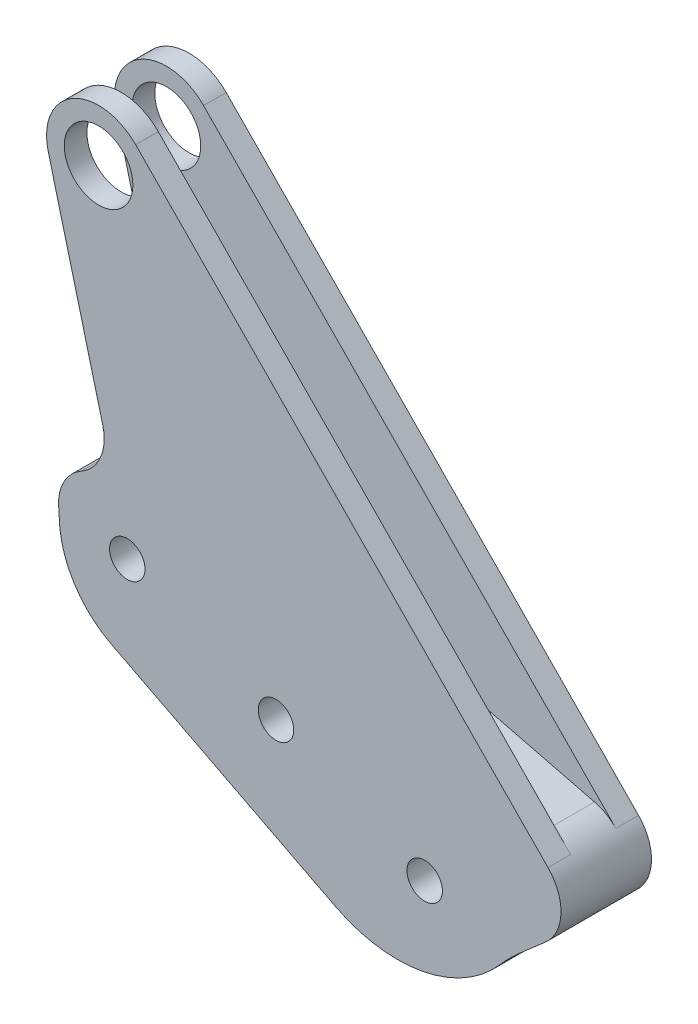
ISO-10303-21;
HEADER;
FILE_DESCRIPTION(('STEP AP214'),'2;1');
FILE_NAME('part.step','',(''),(''),'','','');
FILE_SCHEMA(('AUTOMOTIVE_DESIGN { 1 0 10303 214 1 1 1 1 }'));
ENDSEC;
DATA;
#1=APPLICATION_CONTEXT('core data for automotive mechanical design processes');
#2=APPLICATION_PROTOCOL_DEFINITION('international standard','automotive_design',2000,#1);
#3=PRODUCT_CONTEXT('',#1,'mechanical');
#4=PRODUCT('Part','Part','',(#3));
#5=PRODUCT_RELATED_PRODUCT_CATEGORY('part','',(#4));
#6=PRODUCT_DEFINITION_FORMATION('','',#4);
#7=PRODUCT_DEFINITION_CONTEXT('part definition',#1,'design');
#8=PRODUCT_DEFINITION('design','',#6,#7);
#9=PRODUCT_DEFINITION_SHAPE('','',#8);
#10=(LENGTH_UNIT() NAMED_UNIT(*) SI_UNIT(.MILLI.,.METRE.));
#11=(NAMED_UNIT(*) PLANE_ANGLE_UNIT() SI_UNIT($,.RADIAN.));
#12=(NAMED_UNIT(*) SI_UNIT($,.STERADIAN.) SOLID_ANGLE_UNIT());
#13=UNCERTAINTY_MEASURE_WITH_UNIT(LENGTH_MEASURE(1.E-05),#10,'distance_accuracy_value','');
#14=(GEOMETRIC_REPRESENTATION_CONTEXT(3) GLOBAL_UNCERTAINTY_ASSIGNED_CONTEXT((#13)) GLOBAL_UNIT_ASSIGNED_CONTEXT((#10,
#11,#12)) REPRESENTATION_CONTEXT('',''));
#15=CARTESIAN_POINT('',(0.,0.,0.));
#16=DIRECTION('',(0.,0.,1.));
#17=DIRECTION('',(1.,0.,0.));
#18=AXIS2_PLACEMENT_3D('',#15,#16,#17);
#19=CARTESIAN_POINT('',(88.7215933381022,356.844491165413,3.175));
#20=DIRECTION('',(-0.241282436614149,-0.97045493753267,0.));
#21=DIRECTION('',(0.970454937532671,-0.241282436614149,0.));
#22=AXIS2_PLACEMENT_3D('',#19,#20,#21);
#23=PLANE('',#22);
#24=DIRECTION('',(-0.970454937532671,0.241282436614149,0.));
#25=VECTOR('',#24,1.);
#26=CARTESIAN_POINT('',(88.7215933381022,356.844491165413,0.));
#27=LINE('',#26,#25);
#28=CARTESIAN_POINT('',(409.152663011232,277.176300229955,0.));
#29=VERTEX_POINT('',#28);
#30=CARTESIAN_POINT('',(351.340613212572,291.55000446041,0.));
#31=VERTEX_POINT('',#30);
#32=EDGE_CURVE('E267',#29,#31,#27,.T.);
#33=ORIENTED_EDGE('',*,*,#32,.T.);
#34=DIRECTION('',(0.,0.,-1.));
#35=VECTOR('',#34,1.);
#36=CARTESIAN_POINT('',(351.340613212572,291.55000446041,3.175));
#37=LINE('',#36,#35);
#38=CARTESIAN_POINT('',(351.340613212572,291.55000446041,6.35));
#39=VERTEX_POINT('',#38);
#40=EDGE_CURVE('E290',#39,#31,#37,.T.);
#41=ORIENTED_EDGE('',*,*,#40,.F.);
#42=DIRECTION('',(-0.970454937532671,0.241282436614149,0.));
#43=VECTOR('',#42,1.);
#44=CARTESIAN_POINT('',(409.152663011232,277.176300229955,6.35));
#45=LINE('',#44,#43);
#46=CARTESIAN_POINT('',(409.152663011232,277.176300229955,6.35));
#47=VERTEX_POINT('',#46);
#48=EDGE_CURVE('E196',#47,#39,#45,.T.);
#49=ORIENTED_EDGE('',*,*,#48,.F.);
#50=DIRECTION('',(0.,0.,-1.));
#51=VECTOR('',#50,1.);
#52=CARTESIAN_POINT('',(409.152663011232,277.176300229955,3.175));
#53=LINE('',#52,#51);
#54=EDGE_CURVE('E273',#47,#29,#53,.T.);
#55=ORIENTED_EDGE('',*,*,#54,.T.);
#56=EDGE_LOOP('',(#33,#41,#49,#55));
#57=FACE_BOUND('',#56,.T.);
#58=ADVANCED_FACE('F39',(#57),#23,.F.);
#59=CARTESIAN_POINT('',(349.808469740072,285.387615607076,3.175));
#60=DIRECTION('',(0.,0.,-1.));
#61=DIRECTION('',(-1.,0.,0.));
#62=AXIS2_PLACEMENT_3D('',#59,#60,#61);
#63=CYLINDRICAL_SURFACE('',#62,6.3500000000013);
#64=ORIENTED_EDGE('',*,*,#40,.T.);
#65=CARTESIAN_POINT('',(349.808469740072,285.387615607076,0.));
#66=DIRECTION('',(0.,0.,-1.));
#67=DIRECTION('',(-1.,0.,0.));
#68=AXIS2_PLACEMENT_3D('',#65,#66,#67);
#69=CIRCLE('',#68,6.3500000000013);
#70=CARTESIAN_POINT('',(346.660858499437,290.902599149921,0.));
#71=VERTEX_POINT('',#70);
#72=EDGE_CURVE('E54',#31,#71,#69,.F.);
#73=ORIENTED_EDGE('',*,*,#72,.T.);
#74=DIRECTION('',(0.,0.,-1.));
#75=VECTOR('',#74,1.);
#76=CARTESIAN_POINT('',(346.660858499437,290.902599149921,3.175));
#77=LINE('',#76,#75);
#78=CARTESIAN_POINT('',(346.660858499437,290.902599149921,-3.175));
#79=VERTEX_POINT('',#78);
#80=EDGE_CURVE('E305',#71,#79,#77,.T.);
#81=ORIENTED_EDGE('',*,*,#80,.T.);
#82=CARTESIAN_POINT('',(349.808469740072,285.387615607076,-3.175));
#83=DIRECTION('',(0.,0.,-1.));
#84=DIRECTION('',(-1.,0.,0.));
#85=AXIS2_PLACEMENT_3D('',#82,#83,#84);
#86=CIRCLE('',#85,6.3500000000013);
#87=CARTESIAN_POINT('',(343.504200024932,284.626903204923,-3.175));
#88=VERTEX_POINT('',#87);
#89=EDGE_CURVE('E240',#88,#79,#86,.T.);
#90=ORIENTED_EDGE('',*,*,#89,.F.);
#91=DIRECTION('',(0.,0.,-1.));
#92=VECTOR('',#91,1.);
#93=CARTESIAN_POINT('',(343.504200024932,284.626903204923,3.175));
#94=LINE('',#93,#92);
#95=CARTESIAN_POINT('',(343.504200024932,284.626903204923,9.525));
#96=VERTEX_POINT('',#95);
#97=EDGE_CURVE('E288',#96,#88,#94,.T.);
#98=ORIENTED_EDGE('',*,*,#97,.F.);
#99=CARTESIAN_POINT('',(349.808469740072,285.387615607076,9.525));
#100=DIRECTION('',(0.,0.,1.));
#101=DIRECTION('',(1.,0.,0.));
#102=AXIS2_PLACEMENT_3D('',#99,#100,#101);
#103=CIRCLE('',#102,6.35000000000136);
#104=CARTESIAN_POINT('',(346.660858499437,290.902599149921,9.525));
#105=VERTEX_POINT('',#104);
#106=EDGE_CURVE('E177',#105,#96,#103,.T.);
#107=ORIENTED_EDGE('',*,*,#106,.F.);
#108=DIRECTION('',(0.,0.,-1.));
#109=VECTOR('',#108,1.);
#110=CARTESIAN_POINT('',(346.660858499437,290.902599149921,3.175));
#111=LINE('',#110,#109);
#112=CARTESIAN_POINT('',(346.660858499437,290.902599149921,6.35));
#113=VERTEX_POINT('',#112);
#114=EDGE_CURVE('E294',#105,#113,#111,.T.);
#115=ORIENTED_EDGE('',*,*,#114,.T.);
#116=CARTESIAN_POINT('',(349.808469740072,285.387615607076,6.35));
#117=DIRECTION('',(0.,0.,1.));
#118=DIRECTION('',(1.,0.,0.));
#119=AXIS2_PLACEMENT_3D('',#116,#117,#118);
#120=CIRCLE('',#119,6.3500000000013);
#121=EDGE_CURVE('E292',#113,#39,#120,.F.);
#122=ORIENTED_EDGE('',*,*,#121,.T.);
#123=EDGE_LOOP('',(#64,#73,#81,#90,#98,#107,#115,#122));
#124=FACE_BOUND('',#123,.T.);
#125=ADVANCED_FACE('F309',(#124),#63,.T.);
#126=CARTESIAN_POINT('',(336.241681313093,283.750562517643,3.175));
#127=DIRECTION('',(0.,0.,-1.));
#128=DIRECTION('',(-1.,0.,0.));
#129=AXIS2_PLACEMENT_3D('',#126,#127,#128);
#130=CYLINDRICAL_SURFACE('',#129,7.31519999999985);
#131=ORIENTED_EDGE('',*,*,#97,.T.);
#132=CARTESIAN_POINT('',(336.241681313093,283.750562517643,-3.175));
#133=DIRECTION('',(0.,0.,-1.));
#134=DIRECTION('',(-1.,0.,0.));
#135=AXIS2_PLACEMENT_3D('',#132,#133,#134);
#136=CIRCLE('',#135,7.31519999999985);
#137=CARTESIAN_POINT('',(343.556433482051,283.831505378497,-3.175));
#138=VERTEX_POINT('',#137);
#139=EDGE_CURVE('E237',#138,#88,#136,.F.);
#140=ORIENTED_EDGE('',*,*,#139,.F.);
#141=DIRECTION('',(0.,0.,-1.));
#142=VECTOR('',#141,1.);
#143=CARTESIAN_POINT('',(343.556433482051,283.831505378497,3.175));
#144=LINE('',#143,#142);
#145=CARTESIAN_POINT('',(343.556433482051,283.831505378497,9.525));
#146=VERTEX_POINT('',#145);
#147=EDGE_CURVE('E286',#146,#138,#144,.T.);
#148=ORIENTED_EDGE('',*,*,#147,.F.);
#149=CARTESIAN_POINT('',(336.241681313093,283.750562517643,9.525));
#150=DIRECTION('',(0.,0.,-1.));
#151=DIRECTION('',(1.,0.,0.));
#152=AXIS2_PLACEMENT_3D('',#149,#150,#151);
#153=CIRCLE('',#152,7.31519999999985);
#154=EDGE_CURVE('E370',#96,#146,#153,.T.);
#155=ORIENTED_EDGE('',*,*,#154,.F.);
#156=EDGE_LOOP('',(#131,#140,#148,#155));
#157=FACE_BOUND('',#156,.T.);
#158=ADVANCED_FACE('F396',(#157),#130,.F.);
#159=CARTESIAN_POINT('',(357.075851611338,283.981107218067,3.175));
#160=DIRECTION('',(0.,0.,-1.));
#161=DIRECTION('',(-1.,0.,0.));
#162=AXIS2_PLACEMENT_3D('',#159,#160,#161);
#163=CYLINDRICAL_SURFACE('',#162,13.520245828568);
#164=ORIENTED_EDGE('',*,*,#147,.T.);
#165=CARTESIAN_POINT('',(357.075851611338,283.981107218067,-3.175));
#166=DIRECTION('',(0.,0.,-1.));
#167=DIRECTION('',(-1.,0.,0.));
#168=AXIS2_PLACEMENT_3D('',#165,#166,#167);
#169=CIRCLE('',#168,13.520245828568);
#170=CARTESIAN_POINT('',(350.899273805199,271.954181847483,-3.175));
#171=VERTEX_POINT('',#170);
#172=EDGE_CURVE('E234',#171,#138,#169,.T.);
#173=ORIENTED_EDGE('',*,*,#172,.F.);
#174=DIRECTION('',(0.,0.,-1.));
#175=VECTOR('',#174,1.);
#176=CARTESIAN_POINT('',(350.899273805198,271.954181847483,3.175));
#177=LINE('',#176,#175);
#178=CARTESIAN_POINT('',(350.899273805199,271.954181847483,9.525));
#179=VERTEX_POINT('',#178);
#180=EDGE_CURVE('E284',#179,#171,#177,.T.);
#181=ORIENTED_EDGE('',*,*,#180,.F.);
#182=CARTESIAN_POINT('',(357.075851611338,283.981107218067,9.525));
#183=DIRECTION('',(0.,0.,1.));
#184=DIRECTION('',(1.,0.,0.));
#185=AXIS2_PLACEMENT_3D('',#182,#183,#184);
#186=CIRCLE('',#185,13.520245828568);
#187=EDGE_CURVE('E372',#146,#179,#186,.T.);
#188=ORIENTED_EDGE('',*,*,#187,.F.);
#189=EDGE_LOOP('',(#164,#173,#181,#188));
#190=FACE_BOUND('',#189,.T.);
#191=ADVANCED_FACE('F393',(#190),#163,.T.);
#192=CARTESIAN_POINT('',(183.750390628046,357.795579406841,3.175));
#193=DIRECTION('',(0.456839164350765,0.889549311682773,0.));
#194=DIRECTION('',(-0.889549311682773,0.456839164350765,0.));
#195=AXIS2_PLACEMENT_3D('',#192,#193,#194);
#196=PLANE('',#195);
#197=ORIENTED_EDGE('',*,*,#180,.T.);
#198=DIRECTION('',(-0.889549311682773,0.456839164350765,0.));
#199=VECTOR('',#198,1.);
#200=CARTESIAN_POINT('',(183.750390628046,357.79557940684,-3.175));
#201=LINE('',#200,#199);
#202=CARTESIAN_POINT('',(382.305231818593,255.825259677521,-3.175));
#203=VERTEX_POINT('',#202);
#204=EDGE_CURVE('E231',#203,#171,#201,.T.);
#205=ORIENTED_EDGE('',*,*,#204,.F.);
#206=DIRECTION('',(0.,0.,-1.));
#207=VECTOR('',#206,1.);
#208=CARTESIAN_POINT('',(382.305231818593,255.825259677521,3.175));
#209=LINE('',#208,#207);
#210=CARTESIAN_POINT('',(382.305231818593,255.82525967752,9.525));
#211=VERTEX_POINT('',#210);
#212=EDGE_CURVE('E282',#211,#203,#209,.T.);
#213=ORIENTED_EDGE('',*,*,#212,.F.);
#214=DIRECTION('',(0.889549311682772,-0.456839164350767,0.));
#215=VECTOR('',#214,1.);
#216=CARTESIAN_POINT('',(350.899273805199,271.954181847483,9.525));
#217=LINE('',#216,#215);
#218=EDGE_CURVE('E377',#179,#211,#217,.T.);
#219=ORIENTED_EDGE('',*,*,#218,.F.);
#220=EDGE_LOOP('',(#197,#205,#213,#219));
#221=FACE_BOUND('',#220,.T.);
#222=ADVANCED_FACE('F389',(#221),#196,.F.);
#223=CARTESIAN_POINT('',(391.008017899474,272.771174065075,3.175));
#224=DIRECTION('',(0.,0.,-1.));
#225=DIRECTION('',(-1.,0.,0.));
#226=AXIS2_PLACEMENT_3D('',#223,#224,#225);
#227=CYLINDRICAL_SURFACE('',#226,19.0499999999964);
#228=ORIENTED_EDGE('',*,*,#212,.T.);
#229=CARTESIAN_POINT('',(391.008017899474,272.771174065075,-3.175));
#230=DIRECTION('',(0.,0.,-1.));
#231=DIRECTION('',(-1.,0.,0.));
#232=AXIS2_PLACEMENT_3D('',#229,#230,#231);
#233=CIRCLE('',#232,19.0499999999964);
#234=CARTESIAN_POINT('',(405.371050703044,260.256950610005,-3.175));
#235=VERTEX_POINT('',#234);
#236=EDGE_CURVE('E228',#235,#203,#233,.T.);
#237=ORIENTED_EDGE('',*,*,#236,.F.);
#238=DIRECTION('',(0.,0.,-1.));
#239=VECTOR('',#238,1.);
#240=CARTESIAN_POINT('',(405.371050703044,260.256950610005,3.175));
#241=LINE('',#240,#239);
#242=CARTESIAN_POINT('',(405.371050703046,260.256950610003,9.525));
#243=VERTEX_POINT('',#242);
#244=EDGE_CURVE('E280',#243,#235,#241,.T.);
#245=ORIENTED_EDGE('',*,*,#244,.F.);
#246=CARTESIAN_POINT('',(391.008017899474,272.771174065075,9.525));
#247=DIRECTION('',(0.,0.,1.));
#248=DIRECTION('',(1.,0.,0.));
#249=AXIS2_PLACEMENT_3D('',#246,#247,#248);
#250=CIRCLE('',#249,19.0499999999973);
#251=EDGE_CURVE('E349',#211,#243,#250,.T.);
#252=ORIENTED_EDGE('',*,*,#251,.F.);
#253=EDGE_LOOP('',(#228,#237,#245,#252));
#254=FACE_BOUND('',#253,.T.);
#255=ADVANCED_FACE('F387',(#254),#227,.T.);
#256=CARTESIAN_POINT('',(427.990000000004,240.549512098068,3.175));
#257=DIRECTION('',(0.,0.,-1.));
#258=DIRECTION('',(-1.,0.,0.));
#259=AXIS2_PLACEMENT_3D('',#256,#257,#258);
#260=CYLINDRICAL_SURFACE('',#259,30.);
#261=ORIENTED_EDGE('',*,*,#244,.T.);
#262=CARTESIAN_POINT('',(427.990000000004,240.549512098068,-3.175));
#263=DIRECTION('',(0.,0.,-1.));
#264=DIRECTION('',(-1.,0.,0.));
#265=AXIS2_PLACEMENT_3D('',#262,#263,#264);
#266=CIRCLE('',#265,30.);
#267=CARTESIAN_POINT('',(408.282077798581,263.168039956942,-3.175));
#268=VERTEX_POINT('',#267);
#269=EDGE_CURVE('E225',#268,#235,#266,.F.);
#270=ORIENTED_EDGE('',*,*,#269,.F.);
#271=DIRECTION('',(0.,0.,-1.));
#272=VECTOR('',#271,1.);
#273=CARTESIAN_POINT('',(408.282077798581,263.168039956942,3.175));
#274=LINE('',#273,#272);
#275=CARTESIAN_POINT('',(408.282077798581,263.168039956942,9.525));
#276=VERTEX_POINT('',#275);
#277=EDGE_CURVE('E278',#276,#268,#274,.T.);
#278=ORIENTED_EDGE('',*,*,#277,.F.);
#279=CARTESIAN_POINT('',(427.990000000004,240.549512098068,9.525));
#280=DIRECTION('',(0.,0.,-1.));
#281=DIRECTION('',(1.,0.,0.));
#282=AXIS2_PLACEMENT_3D('',#279,#280,#281);
#283=CIRCLE('',#282,30.0000000000009);
#284=EDGE_CURVE('E346',#243,#276,#283,.T.);
#285=ORIENTED_EDGE('',*,*,#284,.F.);
#286=EDGE_LOOP('',(#261,#270,#278,#285));
#287=FACE_BOUND('',#286,.T.);
#288=ADVANCED_FACE('F383',(#287),#260,.F.);
#289=CARTESIAN_POINT('',(45.8519652743914,-52.6237085443779,3.175));
#290=DIRECTION('',(-0.656930740047429,0.753950928629137,0.));
#291=DIRECTION('',(-0.753950928629137,-0.656930740047429,0.));
#292=AXIS2_PLACEMENT_3D('',#289,#290,#291);
#293=PLANE('',#292);
#294=ORIENTED_EDGE('',*,*,#277,.T.);
#295=DIRECTION('',(-0.753950928629137,-0.656930740047429,0.));
#296=VECTOR('',#295,1.);
#297=CARTESIAN_POINT('',(45.8519652743914,-52.6237085443779,-3.175));
#298=LINE('',#297,#296);
#299=CARTESIAN_POINT('',(411.792029738034,266.226322979828,-3.175));
#300=VERTEX_POINT('',#299);
#301=EDGE_CURVE('E222',#300,#268,#298,.T.);
#302=ORIENTED_EDGE('',*,*,#301,.F.);
#303=DIRECTION('',(0.,0.,-1.));
#304=VECTOR('',#303,1.);
#305=CARTESIAN_POINT('',(411.792029738034,266.226322979828,3.175));
#306=LINE('',#305,#304);
#307=CARTESIAN_POINT('',(411.792029738034,266.226322979828,9.525));
#308=VERTEX_POINT('',#307);
#309=EDGE_CURVE('E276',#308,#300,#306,.T.);
#310=ORIENTED_EDGE('',*,*,#309,.F.);
#311=DIRECTION('',(0.753950928629145,0.656930740047419,0.));
#312=VECTOR('',#311,1.);
#313=CARTESIAN_POINT('',(408.282077798581,263.168039956942,9.525));
#314=LINE('',#313,#312);
#315=EDGE_CURVE('E342',#276,#308,#314,.T.);
#316=ORIENTED_EDGE('',*,*,#315,.F.);
#317=EDGE_LOOP('',(#294,#302,#310,#316));
#318=FACE_BOUND('',#317,.T.);
#319=ADVANCED_FACE('F341',(#318),#293,.F.);
#320=CARTESIAN_POINT('',(407.620519538733,271.013911376623,3.175));
#321=DIRECTION('',(0.,0.,-1.));
#322=DIRECTION('',(-1.,0.,0.));
#323=AXIS2_PLACEMENT_3D('',#320,#321,#322);
#324=CYLINDRICAL_SURFACE('',#323,6.34999999999994);
#325=ORIENTED_EDGE('',*,*,#309,.T.);
#326=CARTESIAN_POINT('',(407.620519538733,271.013911376623,-3.175));
#327=DIRECTION('',(0.,0.,-1.));
#328=DIRECTION('',(-1.,0.,0.));
#329=AXIS2_PLACEMENT_3D('',#326,#327,#328);
#330=CIRCLE('',#329,6.34999999999994);
#331=CARTESIAN_POINT('',(412.150918526643,275.463404045495,-3.175));
#332=VERTEX_POINT('',#331);
#333=EDGE_CURVE('E218',#332,#300,#330,.T.);
#334=ORIENTED_EDGE('',*,*,#333,.F.);
#335=DIRECTION('',(0.,0.,1.));
#336=VECTOR('',#335,1.);
#337=CARTESIAN_POINT('',(412.150918526643,275.463404045495,-3.175));
#338=LINE('',#337,#336);
#339=CARTESIAN_POINT('',(412.150918526643,275.463404045495,0.));
#340=VERTEX_POINT('',#339);
#341=EDGE_CURVE('E264',#332,#340,#338,.T.);
#342=ORIENTED_EDGE('',*,*,#341,.T.);
#343=CARTESIAN_POINT('',(407.620519538733,271.013911376623,0.));
#344=DIRECTION('',(0.,0.,1.));
#345=DIRECTION('',(1.,0.,0.));
#346=AXIS2_PLACEMENT_3D('',#343,#344,#345);
#347=CIRCLE('',#346,6.34999999999994);
#348=EDGE_CURVE('E270',#340,#29,#347,.T.);
#349=ORIENTED_EDGE('',*,*,#348,.T.);
#350=ORIENTED_EDGE('',*,*,#54,.F.);
#351=CARTESIAN_POINT('',(407.620519538733,271.013911376623,6.35));
#352=DIRECTION('',(0.,0.,1.));
#353=DIRECTION('',(1.,0.,0.));
#354=AXIS2_PLACEMENT_3D('',#351,#352,#353);
#355=CIRCLE('',#354,6.34999999999997);
#356=CARTESIAN_POINT('',(412.150918526643,275.463404045495,6.35));
#357=VERTEX_POINT('',#356);
#358=EDGE_CURVE('E192',#357,#47,#355,.T.);
#359=ORIENTED_EDGE('',*,*,#358,.F.);
#360=DIRECTION('',(0.,0.,-1.));
#361=VECTOR('',#360,1.);
#362=CARTESIAN_POINT('',(412.150918526643,275.463404045495,9.525));
#363=LINE('',#362,#361);
#364=CARTESIAN_POINT('',(412.150918526643,275.463404045495,9.525));
#365=VERTEX_POINT('',#364);
#366=EDGE_CURVE('E193',#365,#357,#363,.T.);
#367=ORIENTED_EDGE('',*,*,#366,.F.);
#368=CARTESIAN_POINT('',(407.620519538733,271.013911376623,9.525));
#369=DIRECTION('',(0.,0.,1.));
#370=DIRECTION('',(1.,0.,0.));
#371=AXIS2_PLACEMENT_3D('',#368,#369,#370);
#372=CIRCLE('',#371,6.34999999999996);
#373=EDGE_CURVE('E337',#308,#365,#372,.T.);
#374=ORIENTED_EDGE('',*,*,#373,.F.);
#375=EDGE_LOOP('',(#325,#334,#342,#349,#350,#359,#367,#374));
#376=FACE_BOUND('',#375,.T.);
#377=ADVANCED_FACE('F334',(#376),#324,.T.);
#378=CARTESIAN_POINT('',(347.497865744113,341.292060633783,-3.175));
#379=DIRECTION('',(0.713448659513392,0.700707506908941,0.));
#380=DIRECTION('',(-0.700707506908941,0.713448659513393,0.));
#381=AXIS2_PLACEMENT_3D('',#378,#379,#380);
#382=PLANE('',#381);
#383=DIRECTION('',(-0.700707506908941,0.713448659513393,0.));
#384=VECTOR('',#383,1.);
#385=CARTESIAN_POINT('',(347.497865744113,341.292060633783,0.));
#386=LINE('',#385,#384);
#387=CARTESIAN_POINT('',(354.286795224026,334.379686227604,0.));
#388=VERTEX_POINT('',#387);
#389=EDGE_CURVE('E209',#340,#388,#386,.T.);
#390=ORIENTED_EDGE('',*,*,#389,.F.);
#391=ORIENTED_EDGE('',*,*,#341,.F.);
#392=DIRECTION('',(-0.700707506908941,0.713448659513393,0.));
#393=VECTOR('',#392,1.);
#394=CARTESIAN_POINT('',(347.497865744113,341.292060633783,-3.175));
#395=LINE('',#394,#393);
#396=CARTESIAN_POINT('',(354.286795224026,334.379686227604,-3.175));
#397=VERTEX_POINT('',#396);
#398=EDGE_CURVE('E215',#332,#397,#395,.T.);
#399=ORIENTED_EDGE('',*,*,#398,.T.);
#400=DIRECTION('',(0.,0.,1.));
#401=VECTOR('',#400,1.);
#402=CARTESIAN_POINT('',(354.286795224026,334.379686227604,-3.175));
#403=LINE('',#402,#401);
#404=EDGE_CURVE('E251',#397,#388,#403,.T.);
#405=ORIENTED_EDGE('',*,*,#404,.T.);
#406=EDGE_LOOP('',(#390,#391,#399,#405));
#407=FACE_BOUND('',#406,.T.);
#408=ADVANCED_FACE('F332',(#407),#382,.T.);
#409=CARTESIAN_POINT('',(400.105216615457,104.069138523309,-3.175));
#410=DIRECTION('',(-0.967797889043687,-0.251728516387364,0.));
#411=DIRECTION('',(0.251728516387364,-0.967797889043687,0.));
#412=AXIS2_PLACEMENT_3D('',#409,#410,#411);
#413=PLANE('',#412);
#414=DIRECTION('',(0.251728516387364,-0.967797889043687,0.));
#415=VECTOR('',#414,1.);
#416=CARTESIAN_POINT('',(400.105216615457,104.069138523309,-3.175));
#417=LINE('',#416,#415);
#418=CARTESIAN_POINT('',(342.009492303188,327.424522167483,-3.175));
#419=VERTEX_POINT('',#418);
#420=CARTESIAN_POINT('',(349.658763854231,298.016058771824,-3.175));
#421=VERTEX_POINT('',#420);
#422=EDGE_CURVE('E243',#419,#421,#417,.T.);
#423=ORIENTED_EDGE('',*,*,#422,.T.);
#424=DIRECTION('',(0.,0.,-1.));
#425=VECTOR('',#424,1.);
#426=CARTESIAN_POINT('',(349.658763854231,298.016058771824,-3.175));
#427=LINE('',#426,#425);
#428=CARTESIAN_POINT('',(349.658763854231,298.016058771824,0.));
#429=VERTEX_POINT('',#428);
#430=EDGE_CURVE('E302',#421,#429,#427,.F.);
#431=ORIENTED_EDGE('',*,*,#430,.T.);
#432=DIRECTION('',(0.251728516387364,-0.967797889043687,0.));
#433=VECTOR('',#432,1.);
#434=CARTESIAN_POINT('',(400.105216615457,104.069138523309,0.));
#435=LINE('',#434,#433);
#436=CARTESIAN_POINT('',(342.009492303188,327.424522167483,0.));
#437=VERTEX_POINT('',#436);
#438=EDGE_CURVE('E254',#437,#429,#435,.T.);
#439=ORIENTED_EDGE('',*,*,#438,.F.);
#440=DIRECTION('',(0.,0.,1.));
#441=VECTOR('',#440,1.);
#442=CARTESIAN_POINT('',(342.009492303188,327.424522167483,-3.175));
#443=LINE('',#442,#441);
#444=EDGE_CURVE('E262',#419,#437,#443,.T.);
#445=ORIENTED_EDGE('',*,*,#444,.F.);
#446=EDGE_LOOP('',(#423,#431,#439,#445));
#447=FACE_BOUND('',#446,.T.);
#448=ADVANCED_FACE('F321',(#447),#413,.T.);
#449=CARTESIAN_POINT('',(349.076836387929,329.262769658402,-3.175));
#450=DIRECTION('',(0.,0.,1.));
#451=DIRECTION('',(1.,0.,0.));
#452=AXIS2_PLACEMENT_3D('',#449,#450,#451);
#453=CYLINDRICAL_SURFACE('',#452,7.3024999999999);
#454=CARTESIAN_POINT('',(349.076836387929,329.262769658402,0.));
#455=DIRECTION('',(0.,0.,-1.));
#456=DIRECTION('',(-1.,0.,0.));
#457=AXIS2_PLACEMENT_3D('',#454,#455,#456);
#458=CIRCLE('',#457,7.3024999999999);
#459=EDGE_CURVE('E256',#437,#388,#458,.T.);
#460=ORIENTED_EDGE('',*,*,#459,.T.);
#461=ORIENTED_EDGE('',*,*,#404,.F.);
#462=CARTESIAN_POINT('',(349.076836387929,329.262769658402,-3.175));
#463=DIRECTION('',(0.,0.,-1.));
#464=DIRECTION('',(-1.,0.,0.));
#465=AXIS2_PLACEMENT_3D('',#462,#463,#464);
#466=CIRCLE('',#465,7.3024999999999);
#467=EDGE_CURVE('E246',#419,#397,#466,.T.);
#468=ORIENTED_EDGE('',*,*,#467,.F.);
#469=ORIENTED_EDGE('',*,*,#444,.T.);
#470=EDGE_LOOP('',(#460,#461,#468,#469));
#471=FACE_BOUND('',#470,.T.);
#472=ADVANCED_FACE('F327',(#471),#453,.T.);
#473=CARTESIAN_POINT('',(349.076836387929,329.262769658402,-3.175));
#474=DIRECTION('',(0.,0.,1.));
#475=DIRECTION('',(1.,0.,0.));
#476=AXIS2_PLACEMENT_3D('',#473,#474,#475);
#477=CYLINDRICAL_SURFACE('',#476,4.81330000000001);
#478=CARTESIAN_POINT('',(349.076836387929,329.262769658402,-3.175));
#479=DIRECTION('',(0.,0.,-1.));
#480=DIRECTION('',(-1.,0.,0.));
#481=AXIS2_PLACEMENT_3D('',#478,#479,#480);
#482=CIRCLE('',#481,4.81330000000001);
#483=CARTESIAN_POINT('',(344.263536387929,329.262769658402,-3.175));
#484=VERTEX_POINT('',#483);
#485=EDGE_CURVE('E248',#484,#484,#482,.T.);
#486=ORIENTED_EDGE('',*,*,#485,.T.);
#487=EDGE_LOOP('',(#486));
#488=FACE_BOUND('',#487,.T.);
#489=CARTESIAN_POINT('',(349.076836387929,329.262769658402,0.));
#490=DIRECTION('',(0.,0.,-1.));
#491=DIRECTION('',(-1.,0.,0.));
#492=AXIS2_PLACEMENT_3D('',#489,#490,#491);
#493=CIRCLE('',#492,4.81330000000001);
#494=CARTESIAN_POINT('',(344.263536387929,329.262769658402,0.));
#495=VERTEX_POINT('',#494);
#496=EDGE_CURVE('E219',#495,#495,#493,.T.);
#497=ORIENTED_EDGE('',*,*,#496,.F.);
#498=EDGE_LOOP('',(#497));
#499=FACE_BOUND('',#498,.T.);
#500=ADVANCED_FACE('F451',(#488,#499),#477,.F.);
#501=CARTESIAN_POINT('',(0.,0.,-3.175));
#502=DIRECTION('',(0.,0.,-1.));
#503=DIRECTION('',(-1.,0.,0.));
#504=AXIS2_PLACEMENT_3D('',#501,#502,#503);
#505=PLANE('',#504);
#506=CARTESIAN_POINT('',(353.104936978522,283.44453462264,-3.175));
#507=DIRECTION('',(0.,0.,1.));
#508=DIRECTION('',(1.,0.,0.));
#509=AXIS2_PLACEMENT_3D('',#506,#507,#508);
#510=CIRCLE('',#509,2.48920000000001);
#511=CARTESIAN_POINT('',(355.594136978522,283.44453462264,-3.175));
#512=VERTEX_POINT('',#511);
#513=EDGE_CURVE('E206',#512,#512,#510,.T.);
#514=ORIENTED_EDGE('',*,*,#513,.T.);
#515=EDGE_LOOP('',(#514));
#516=FACE_BOUND('',#515,.T.);
#517=CARTESIAN_POINT('',(373.97286556719,274.327990062438,-3.175));
#518=DIRECTION('',(0.,0.,1.));
#519=DIRECTION('',(1.,0.,0.));
#520=AXIS2_PLACEMENT_3D('',#517,#518,#519);
#521=CIRCLE('',#520,2.48920000000001);
#522=CARTESIAN_POINT('',(376.46206556719,274.327990062438,-3.175));
#523=VERTEX_POINT('',#522);
#524=EDGE_CURVE('E210',#523,#523,#521,.T.);
#525=ORIENTED_EDGE('',*,*,#524,.T.);
#526=EDGE_LOOP('',(#525));
#527=FACE_BOUND('',#526,.T.);
#528=CARTESIAN_POINT('',(394.840794155859,265.211445502237,-3.175));
#529=DIRECTION('',(0.,0.,1.));
#530=DIRECTION('',(1.,0.,0.));
#531=AXIS2_PLACEMENT_3D('',#528,#529,#530);
#532=CIRCLE('',#531,2.48920000000001);
#533=CARTESIAN_POINT('',(397.329994155859,265.211445502237,-3.175));
#534=VERTEX_POINT('',#533);
#535=EDGE_CURVE('E205',#534,#534,#532,.T.);
#536=ORIENTED_EDGE('',*,*,#535,.T.);
#537=EDGE_LOOP('',(#536));
#538=FACE_BOUND('',#537,.T.);
#539=ORIENTED_EDGE('',*,*,#398,.F.);
#540=ORIENTED_EDGE('',*,*,#333,.T.);
#541=ORIENTED_EDGE('',*,*,#301,.T.);
#542=ORIENTED_EDGE('',*,*,#269,.T.);
#543=ORIENTED_EDGE('',*,*,#236,.T.);
#544=ORIENTED_EDGE('',*,*,#204,.T.);
#545=ORIENTED_EDGE('',*,*,#172,.T.);
#546=ORIENTED_EDGE('',*,*,#139,.T.);
#547=ORIENTED_EDGE('',*,*,#89,.T.);
#548=CARTESIAN_POINT('',(343.513247258803,296.417582692764,-3.175));
#549=DIRECTION('',(0.,0.,-1.));
#550=DIRECTION('',(-1.,0.,0.));
#551=AXIS2_PLACEMENT_3D('',#548,#549,#550);
#552=CIRCLE('',#551,6.35);
#553=EDGE_CURVE('E11',#79,#421,#552,.F.);
#554=ORIENTED_EDGE('',*,*,#553,.T.);
#555=ORIENTED_EDGE('',*,*,#422,.F.);
#556=ORIENTED_EDGE('',*,*,#467,.T.);
#557=EDGE_LOOP('',(#539,#540,#541,#542,#543,#544,#545,#546,#547,#554,#555,#556));
#558=FACE_BOUND('',#557,.T.);
#559=ORIENTED_EDGE('',*,*,#485,.F.);
#560=EDGE_LOOP('',(#559));
#561=FACE_BOUND('',#560,.T.);
#562=ADVANCED_FACE('F318',(#516,#527,#538,#558,#561),#505,.T.);
#563=CARTESIAN_POINT('',(0.,0.,0.));
#564=DIRECTION('',(0.,0.,-1.));
#565=DIRECTION('',(-1.,0.,0.));
#566=AXIS2_PLACEMENT_3D('',#563,#564,#565);
#567=PLANE('',#566);
#568=ORIENTED_EDGE('',*,*,#32,.F.);
#569=ORIENTED_EDGE('',*,*,#348,.F.);
#570=ORIENTED_EDGE('',*,*,#389,.T.);
#571=ORIENTED_EDGE('',*,*,#459,.F.);
#572=ORIENTED_EDGE('',*,*,#438,.T.);
#573=CARTESIAN_POINT('',(343.513247258803,296.417582692764,0.));
#574=DIRECTION('',(0.,0.,-1.));
#575=DIRECTION('',(-1.,0.,0.));
#576=AXIS2_PLACEMENT_3D('',#573,#574,#575);
#577=CIRCLE('',#576,6.35);
#578=EDGE_CURVE('E47',#429,#71,#577,.T.);
#579=ORIENTED_EDGE('',*,*,#578,.T.);
#580=ORIENTED_EDGE('',*,*,#72,.F.);
#581=EDGE_LOOP('',(#568,#569,#570,#571,#572,#579,#580));
#582=FACE_BOUND('',#581,.T.);
#583=ORIENTED_EDGE('',*,*,#496,.T.);
#584=EDGE_LOOP('',(#583));
#585=FACE_BOUND('',#584,.T.);
#586=ADVANCED_FACE('F447',(#582,#585),#567,.F.);
#587=CARTESIAN_POINT('',(394.840794155859,265.211445502237,-3.175));
#588=DIRECTION('',(0.,0.,1.));
#589=DIRECTION('',(1.,0.,0.));
#590=AXIS2_PLACEMENT_3D('',#587,#588,#589);
#591=CYLINDRICAL_SURFACE('',#590,2.48920000000001);
#592=ORIENTED_EDGE('',*,*,#535,.F.);
#593=EDGE_LOOP('',(#592));
#594=FACE_BOUND('',#593,.T.);
#595=CARTESIAN_POINT('',(394.840794155859,265.211445502237,9.525));
#596=DIRECTION('',(0.,0.,1.));
#597=DIRECTION('',(1.,0.,0.));
#598=AXIS2_PLACEMENT_3D('',#595,#596,#597);
#599=CIRCLE('',#598,2.48920000000001);
#600=CARTESIAN_POINT('',(397.329994155859,265.211445502237,9.525));
#601=VERTEX_POINT('',#600);
#602=EDGE_CURVE('E754',#601,#601,#599,.T.);
#603=ORIENTED_EDGE('',*,*,#602,.T.);
#604=EDGE_LOOP('',(#603));
#605=FACE_BOUND('',#604,.T.);
#606=ADVANCED_FACE('F443',(#594,#605),#591,.F.);
#607=CARTESIAN_POINT('',(373.97286556719,274.327990062438,-3.175));
#608=DIRECTION('',(0.,0.,1.));
#609=DIRECTION('',(1.,0.,0.));
#610=AXIS2_PLACEMENT_3D('',#607,#608,#609);
#611=CYLINDRICAL_SURFACE('',#610,2.48920000000001);
#612=ORIENTED_EDGE('',*,*,#524,.F.);
#613=EDGE_LOOP('',(#612));
#614=FACE_BOUND('',#613,.T.);
#615=CARTESIAN_POINT('',(373.97286556719,274.327990062438,9.525));
#616=DIRECTION('',(0.,0.,1.));
#617=DIRECTION('',(1.,0.,0.));
#618=AXIS2_PLACEMENT_3D('',#615,#616,#617);
#619=CIRCLE('',#618,2.48920000000001);
#620=CARTESIAN_POINT('',(376.46206556719,274.327990062438,9.525));
#621=VERTEX_POINT('',#620);
#622=EDGE_CURVE('E757',#621,#621,#619,.T.);
#623=ORIENTED_EDGE('',*,*,#622,.T.);
#624=EDGE_LOOP('',(#623));
#625=FACE_BOUND('',#624,.T.);
#626=ADVANCED_FACE('F439',(#614,#625),#611,.F.);
#627=CARTESIAN_POINT('',(353.104936978522,283.44453462264,-3.175));
#628=DIRECTION('',(0.,0.,1.));
#629=DIRECTION('',(1.,0.,0.));
#630=AXIS2_PLACEMENT_3D('',#627,#628,#629);
#631=CYLINDRICAL_SURFACE('',#630,2.48920000000001);
#632=ORIENTED_EDGE('',*,*,#513,.F.);
#633=EDGE_LOOP('',(#632));
#634=FACE_BOUND('',#633,.T.);
#635=CARTESIAN_POINT('',(353.104936978522,283.44453462264,9.525));
#636=DIRECTION('',(0.,0.,1.));
#637=DIRECTION('',(1.,0.,0.));
#638=AXIS2_PLACEMENT_3D('',#635,#636,#637);
#639=CIRCLE('',#638,2.48920000000001);
#640=CARTESIAN_POINT('',(355.594136978522,283.44453462264,9.525));
#641=VERTEX_POINT('',#640);
#642=EDGE_CURVE('E761',#641,#641,#639,.T.);
#643=ORIENTED_EDGE('',*,*,#642,.T.);
#644=EDGE_LOOP('',(#643));
#645=FACE_BOUND('',#644,.T.);
#646=ADVANCED_FACE('F429',(#634,#645),#631,.F.);
#647=CARTESIAN_POINT('',(349.076836387929,329.262769658402,6.35));
#648=DIRECTION('',(0.,0.,1.));
#649=DIRECTION('',(1.,0.,0.));
#650=AXIS2_PLACEMENT_3D('',#647,#648,#649);
#651=PLANE('',#650);
#652=CARTESIAN_POINT('',(349.076836387929,329.262769658402,6.35));
#653=DIRECTION('',(0.,0.,1.));
#654=DIRECTION('',(1.,0.,0.));
#655=AXIS2_PLACEMENT_3D('',#652,#653,#654);
#656=CIRCLE('',#655,4.81330000000001);
#657=CARTESIAN_POINT('',(353.890136387929,329.262769658402,6.35));
#658=VERTEX_POINT('',#657);
#659=EDGE_CURVE('E356',#658,#658,#656,.T.);
#660=ORIENTED_EDGE('',*,*,#659,.T.);
#661=EDGE_LOOP('',(#660));
#662=FACE_BOUND('',#661,.T.);
#663=DIRECTION('',(-0.700707506908941,0.713448659513393,0.));
#664=VECTOR('',#663,1.);
#665=CARTESIAN_POINT('',(412.150918526643,275.463404045495,6.35));
#666=LINE('',#665,#664);
#667=CARTESIAN_POINT('',(354.286795224026,334.379686227604,6.35));
#668=VERTEX_POINT('',#667);
#669=EDGE_CURVE('E187',#357,#668,#666,.T.);
#670=ORIENTED_EDGE('',*,*,#669,.F.);
#671=ORIENTED_EDGE('',*,*,#358,.T.);
#672=ORIENTED_EDGE('',*,*,#48,.T.);
#673=ORIENTED_EDGE('',*,*,#121,.F.);
#674=CARTESIAN_POINT('',(343.513247258803,296.417582692764,6.35));
#675=DIRECTION('',(0.,0.,1.));
#676=DIRECTION('',(1.,0.,0.));
#677=AXIS2_PLACEMENT_3D('',#674,#675,#676);
#678=CIRCLE('',#677,6.35);
#679=CARTESIAN_POINT('',(349.658763854231,298.016058771824,6.35));
#680=VERTEX_POINT('',#679);
#681=EDGE_CURVE('E298',#113,#680,#678,.T.);
#682=ORIENTED_EDGE('',*,*,#681,.T.);
#683=DIRECTION('',(0.251728516387363,-0.967797889043687,0.));
#684=VECTOR('',#683,1.);
#685=CARTESIAN_POINT('',(342.009492303188,327.424522167483,6.35));
#686=LINE('',#685,#684);
#687=CARTESIAN_POINT('',(342.009492303188,327.424522167483,6.35));
#688=VERTEX_POINT('',#687);
#689=EDGE_CURVE('E355',#688,#680,#686,.T.);
#690=ORIENTED_EDGE('',*,*,#689,.F.);
#691=CARTESIAN_POINT('',(349.076836387929,329.262769658402,6.35));
#692=DIRECTION('',(0.,0.,1.));
#693=DIRECTION('',(1.,0.,0.));
#694=AXIS2_PLACEMENT_3D('',#691,#692,#693);
#695=CIRCLE('',#694,7.30249999999998);
#696=EDGE_CURVE('E191',#668,#688,#695,.T.);
#697=ORIENTED_EDGE('',*,*,#696,.F.);
#698=EDGE_LOOP('',(#670,#671,#672,#673,#682,#690,#697));
#699=FACE_BOUND('',#698,.T.);
#700=ADVANCED_FACE('F361',(#662,#699),#651,.F.);
#701=CARTESIAN_POINT('',(349.076836387929,329.262769658402,9.525));
#702=DIRECTION('',(0.,0.,-1.));
#703=DIRECTION('',(-1.,0.,0.));
#704=AXIS2_PLACEMENT_3D('',#701,#702,#703);
#705=CYLINDRICAL_SURFACE('',#704,7.30249999999998);
#706=ORIENTED_EDGE('',*,*,#696,.T.);
#707=DIRECTION('',(0.,0.,-1.));
#708=VECTOR('',#707,1.);
#709=CARTESIAN_POINT('',(342.009492303188,327.424522167483,9.525));
#710=LINE('',#709,#708);
#711=CARTESIAN_POINT('',(342.009492303188,327.424522167483,9.525));
#712=VERTEX_POINT('',#711);
#713=EDGE_CURVE('E171',#712,#688,#710,.T.);
#714=ORIENTED_EDGE('',*,*,#713,.F.);
#715=CARTESIAN_POINT('',(349.076836387929,329.262769658402,9.525));
#716=DIRECTION('',(0.,0.,1.));
#717=DIRECTION('',(1.,0.,0.));
#718=AXIS2_PLACEMENT_3D('',#715,#716,#717);
#719=CIRCLE('',#718,7.30249999999998);
#720=CARTESIAN_POINT('',(354.286795224026,334.379686227604,9.525));
#721=VERTEX_POINT('',#720);
#722=EDGE_CURVE('E178',#721,#712,#719,.T.);
#723=ORIENTED_EDGE('',*,*,#722,.F.);
#724=DIRECTION('',(0.,0.,-1.));
#725=VECTOR('',#724,1.);
#726=CARTESIAN_POINT('',(354.286795224026,334.379686227604,9.525));
#727=LINE('',#726,#725);
#728=EDGE_CURVE('E199',#721,#668,#727,.T.);
#729=ORIENTED_EDGE('',*,*,#728,.T.);
#730=EDGE_LOOP('',(#706,#714,#723,#729));
#731=FACE_BOUND('',#730,.T.);
#732=ADVANCED_FACE('F189',(#731),#705,.T.);
#733=CARTESIAN_POINT('',(342.009492303188,327.424522167483,9.525));
#734=DIRECTION('',(0.967797889043687,0.251728516387363,0.));
#735=DIRECTION('',(-0.251728516387363,0.967797889043687,0.));
#736=AXIS2_PLACEMENT_3D('',#733,#734,#735);
#737=PLANE('',#736);
#738=ORIENTED_EDGE('',*,*,#689,.T.);
#739=DIRECTION('',(0.,0.,1.));
#740=VECTOR('',#739,1.);
#741=CARTESIAN_POINT('',(349.658763854231,298.016058771824,9.525));
#742=LINE('',#741,#740);
#743=CARTESIAN_POINT('',(349.658763854231,298.016058771824,9.525));
#744=VERTEX_POINT('',#743);
#745=EDGE_CURVE('E174',#680,#744,#742,.T.);
#746=ORIENTED_EDGE('',*,*,#745,.T.);
#747=DIRECTION('',(0.251728516387363,-0.967797889043687,0.));
#748=VECTOR('',#747,1.);
#749=CARTESIAN_POINT('',(342.009492303188,327.424522167483,9.525));
#750=LINE('',#749,#748);
#751=EDGE_CURVE('E166',#712,#744,#750,.T.);
#752=ORIENTED_EDGE('',*,*,#751,.F.);
#753=ORIENTED_EDGE('',*,*,#713,.T.);
#754=EDGE_LOOP('',(#738,#746,#752,#753));
#755=FACE_BOUND('',#754,.T.);
#756=ADVANCED_FACE('F169',(#755),#737,.F.);
#757=CARTESIAN_POINT('',(412.150918526643,275.463404045495,9.525));
#758=DIRECTION('',(-0.713448659513392,-0.700707506908941,0.));
#759=DIRECTION('',(0.700707506908941,-0.713448659513393,0.));
#760=AXIS2_PLACEMENT_3D('',#757,#758,#759);
#761=PLANE('',#760);
#762=ORIENTED_EDGE('',*,*,#669,.T.);
#763=ORIENTED_EDGE('',*,*,#728,.F.);
#764=DIRECTION('',(-0.700707506908941,0.713448659513393,0.));
#765=VECTOR('',#764,1.);
#766=CARTESIAN_POINT('',(412.150918526643,275.463404045495,9.525));
#767=LINE('',#766,#765);
#768=EDGE_CURVE('E183',#365,#721,#767,.T.);
#769=ORIENTED_EDGE('',*,*,#768,.F.);
#770=ORIENTED_EDGE('',*,*,#366,.T.);
#771=EDGE_LOOP('',(#762,#763,#769,#770));
#772=FACE_BOUND('',#771,.T.);
#773=ADVANCED_FACE('F421',(#772),#761,.F.);
#774=CARTESIAN_POINT('',(349.076836387929,329.262769658402,9.525));
#775=DIRECTION('',(0.,0.,1.));
#776=DIRECTION('',(1.,0.,0.));
#777=AXIS2_PLACEMENT_3D('',#774,#775,#776);
#778=PLANE('',#777);
#779=CARTESIAN_POINT('',(349.076836387929,329.262769658402,9.525));
#780=DIRECTION('',(0.,0.,1.));
#781=DIRECTION('',(1.,0.,0.));
#782=AXIS2_PLACEMENT_3D('',#779,#780,#781);
#783=CIRCLE('',#782,4.81330000000001);
#784=CARTESIAN_POINT('',(353.890136387929,329.262769658402,9.525));
#785=VERTEX_POINT('',#784);
#786=EDGE_CURVE('E756',#785,#785,#783,.T.);
#787=ORIENTED_EDGE('',*,*,#786,.F.);
#788=EDGE_LOOP('',(#787));
#789=FACE_BOUND('',#788,.T.);
#790=ORIENTED_EDGE('',*,*,#602,.F.);
#791=EDGE_LOOP('',(#790));
#792=FACE_BOUND('',#791,.T.);
#793=ORIENTED_EDGE('',*,*,#622,.F.);
#794=EDGE_LOOP('',(#793));
#795=FACE_BOUND('',#794,.T.);
#796=ORIENTED_EDGE('',*,*,#642,.F.);
#797=EDGE_LOOP('',(#796));
#798=FACE_BOUND('',#797,.T.);
#799=ORIENTED_EDGE('',*,*,#722,.T.);
#800=ORIENTED_EDGE('',*,*,#751,.T.);
#801=CARTESIAN_POINT('',(343.513247258803,296.417582692764,9.525));
#802=DIRECTION('',(0.,0.,1.));
#803=DIRECTION('',(1.,0.,0.));
#804=AXIS2_PLACEMENT_3D('',#801,#802,#803);
#805=CIRCLE('',#804,6.35);
#806=EDGE_CURVE('E300',#744,#105,#805,.F.);
#807=ORIENTED_EDGE('',*,*,#806,.T.);
#808=ORIENTED_EDGE('',*,*,#106,.T.);
#809=ORIENTED_EDGE('',*,*,#154,.T.);
#810=ORIENTED_EDGE('',*,*,#187,.T.);
#811=ORIENTED_EDGE('',*,*,#218,.T.);
#812=ORIENTED_EDGE('',*,*,#251,.T.);
#813=ORIENTED_EDGE('',*,*,#284,.T.);
#814=ORIENTED_EDGE('',*,*,#315,.T.);
#815=ORIENTED_EDGE('',*,*,#373,.T.);
#816=ORIENTED_EDGE('',*,*,#768,.T.);
#817=EDGE_LOOP('',(#799,#800,#807,#808,#809,#810,#811,#812,#813,#814,#815,#816));
#818=FACE_BOUND('',#817,.T.);
#819=ADVANCED_FACE('F181',(#789,#792,#795,#798,#818),#778,.T.);
#820=CARTESIAN_POINT('',(349.076836387929,329.262769658402,-3.175));
#821=DIRECTION('',(0.,0.,1.));
#822=DIRECTION('',(1.,0.,0.));
#823=AXIS2_PLACEMENT_3D('',#820,#821,#822);
#824=CYLINDRICAL_SURFACE('',#823,4.81330000000001);
#825=ORIENTED_EDGE('',*,*,#786,.T.);
#826=EDGE_LOOP('',(#825));
#827=FACE_BOUND('',#826,.T.);
#828=ORIENTED_EDGE('',*,*,#659,.F.);
#829=EDGE_LOOP('',(#828));
#830=FACE_BOUND('',#829,.T.);
#831=ADVANCED_FACE('F411',(#827,#830),#824,.F.);
#832=CARTESIAN_POINT('',(343.513247258803,296.417582692764,3.175));
#833=DIRECTION('',(0.,0.,-1.));
#834=DIRECTION('',(-1.,0.,0.));
#835=AXIS2_PLACEMENT_3D('',#832,#833,#834);
#836=CYLINDRICAL_SURFACE('',#835,6.35);
#837=ORIENTED_EDGE('',*,*,#806,.F.);
#838=ORIENTED_EDGE('',*,*,#745,.F.);
#839=ORIENTED_EDGE('',*,*,#681,.F.);
#840=ORIENTED_EDGE('',*,*,#114,.F.);
#841=EDGE_LOOP('',(#837,#838,#839,#840));
#842=FACE_BOUND('',#841,.T.);
#843=ADVANCED_FACE('F364',(#842),#836,.F.);
#844=CARTESIAN_POINT('',(343.513247258803,296.417582692764,3.175));
#845=DIRECTION('',(0.,0.,-1.));
#846=DIRECTION('',(-1.,0.,0.));
#847=AXIS2_PLACEMENT_3D('',#844,#845,#846);
#848=CYLINDRICAL_SURFACE('',#847,6.35);
#849=ORIENTED_EDGE('',*,*,#553,.F.);
#850=ORIENTED_EDGE('',*,*,#80,.F.);
#851=ORIENTED_EDGE('',*,*,#578,.F.);
#852=ORIENTED_EDGE('',*,*,#430,.F.);
#853=EDGE_LOOP('',(#849,#850,#851,#852));
#854=FACE_BOUND('',#853,.T.);
#855=ADVANCED_FACE('F41',(#854),#848,.F.);
#856=CLOSED_SHELL('',(#58,#125,#158,#191,#222,#255,#288,#319,#377,#408,#448,#472,#500,#562,#586,
#606,#626,#646,#700,#732,#756,#773,#819,#831,#843,#855));
#857=MANIFOLD_SOLID_BREP('B2',#856);
#858=ADVANCED_BREP_SHAPE_REPRESENTATION('',(#18,#857),#14);
#859=SHAPE_DEFINITION_REPRESENTATION(#9,#858);
ENDSEC;
END-ISO-10303-21;
